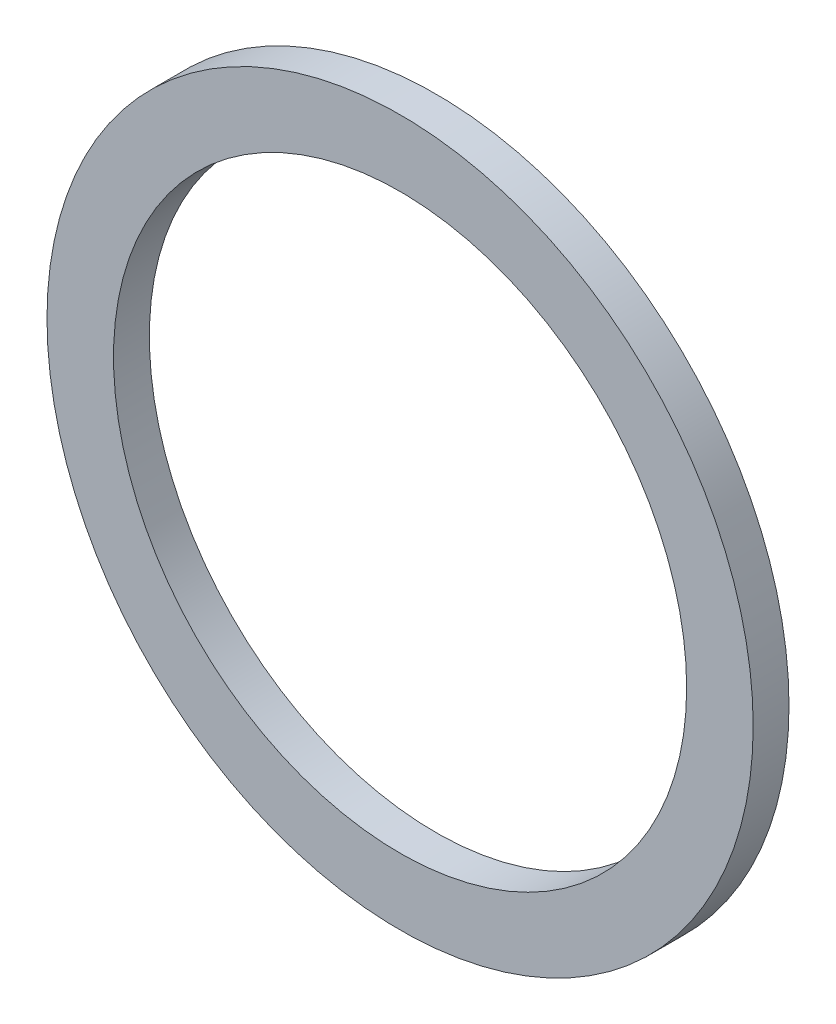
ISO-10303-21;
HEADER;
FILE_DESCRIPTION(('STEP AP214'),'2;1');
FILE_NAME('part.step','',(''),(''),'','','');
FILE_SCHEMA(('AUTOMOTIVE_DESIGN { 1 0 10303 214 1 1 1 1 }'));
ENDSEC;
DATA;
#1=APPLICATION_CONTEXT('core data for automotive mechanical design processes');
#2=APPLICATION_PROTOCOL_DEFINITION('international standard','automotive_design',2000,#1);
#3=PRODUCT_CONTEXT('',#1,'mechanical');
#4=PRODUCT('Part','Part','',(#3));
#5=PRODUCT_RELATED_PRODUCT_CATEGORY('part','',(#4));
#6=PRODUCT_DEFINITION_FORMATION('','',#4);
#7=PRODUCT_DEFINITION_CONTEXT('part definition',#1,'design');
#8=PRODUCT_DEFINITION('design','',#6,#7);
#9=PRODUCT_DEFINITION_SHAPE('','',#8);
#10=(LENGTH_UNIT() NAMED_UNIT(*) SI_UNIT(.MILLI.,.METRE.));
#11=(NAMED_UNIT(*) PLANE_ANGLE_UNIT() SI_UNIT($,.RADIAN.));
#12=(NAMED_UNIT(*) SI_UNIT($,.STERADIAN.) SOLID_ANGLE_UNIT());
#13=UNCERTAINTY_MEASURE_WITH_UNIT(LENGTH_MEASURE(1.E-05),#10,'distance_accuracy_value','');
#14=(GEOMETRIC_REPRESENTATION_CONTEXT(3) GLOBAL_UNCERTAINTY_ASSIGNED_CONTEXT((#13)) GLOBAL_UNIT_ASSIGNED_CONTEXT((#10,
#11,#12)) REPRESENTATION_CONTEXT('',''));
#15=CARTESIAN_POINT('',(0.,0.,0.));
#16=DIRECTION('',(0.,0.,1.));
#17=DIRECTION('',(1.,0.,0.));
#18=AXIS2_PLACEMENT_3D('',#15,#16,#17);
#19=CARTESIAN_POINT('',(0.,0.,1.75));
#20=DIRECTION('',(0.,0.,1.));
#21=DIRECTION('',(1.,0.,0.));
#22=AXIS2_PLACEMENT_3D('',#19,#20,#21);
#23=PLANE('',#22);
#24=CARTESIAN_POINT('',(0.,0.,1.75));
#25=DIRECTION('',(0.,0.,1.));
#26=DIRECTION('',(1.,0.,0.));
#27=AXIS2_PLACEMENT_3D('',#24,#25,#26);
#28=CIRCLE('',#27,17.25);
#29=CARTESIAN_POINT('',(17.25,0.,1.75));
#30=VERTEX_POINT('',#29);
#31=EDGE_CURVE('E10',#30,#30,#28,.T.);
#32=ORIENTED_EDGE('',*,*,#31,.T.);
#33=EDGE_LOOP('',(#32));
#34=FACE_BOUND('',#33,.T.);
#35=CARTESIAN_POINT('',(0.,0.,1.75));
#36=DIRECTION('',(0.,0.,1.));
#37=DIRECTION('',(1.,0.,0.));
#38=AXIS2_PLACEMENT_3D('',#35,#36,#37);
#39=CIRCLE('',#38,14.);
#40=CARTESIAN_POINT('',(14.,0.,1.75));
#41=VERTEX_POINT('',#40);
#42=EDGE_CURVE('E42',#41,#41,#39,.T.);
#43=ORIENTED_EDGE('',*,*,#42,.F.);
#44=EDGE_LOOP('',(#43));
#45=FACE_BOUND('',#44,.T.);
#46=ADVANCED_FACE('F31',(#34,#45),#23,.T.);
#47=CARTESIAN_POINT('',(0.,0.,0.));
#48=DIRECTION('',(0.,0.,1.));
#49=DIRECTION('',(1.,0.,0.));
#50=AXIS2_PLACEMENT_3D('',#47,#48,#49);
#51=PLANE('',#50);
#52=CARTESIAN_POINT('',(0.,0.,0.));
#53=DIRECTION('',(0.,0.,1.));
#54=DIRECTION('',(1.,0.,0.));
#55=AXIS2_PLACEMENT_3D('',#52,#53,#54);
#56=CIRCLE('',#55,17.25);
#57=CARTESIAN_POINT('',(17.25,0.,0.));
#58=VERTEX_POINT('',#57);
#59=EDGE_CURVE('E35',#58,#58,#56,.T.);
#60=ORIENTED_EDGE('',*,*,#59,.F.);
#61=EDGE_LOOP('',(#60));
#62=FACE_BOUND('',#61,.T.);
#63=CARTESIAN_POINT('',(0.,0.,0.));
#64=DIRECTION('',(0.,0.,1.));
#65=DIRECTION('',(1.,0.,0.));
#66=AXIS2_PLACEMENT_3D('',#63,#64,#65);
#67=CIRCLE('',#66,14.);
#68=CARTESIAN_POINT('',(14.,0.,0.));
#69=VERTEX_POINT('',#68);
#70=EDGE_CURVE('E44',#69,#69,#67,.T.);
#71=ORIENTED_EDGE('',*,*,#70,.T.);
#72=EDGE_LOOP('',(#71));
#73=FACE_BOUND('',#72,.T.);
#74=ADVANCED_FACE('F54',(#62,#73),#51,.F.);
#75=CARTESIAN_POINT('',(0.,0.,1.75));
#76=DIRECTION('',(0.,0.,-1.));
#77=DIRECTION('',(-1.,0.,0.));
#78=AXIS2_PLACEMENT_3D('',#75,#76,#77);
#79=CYLINDRICAL_SURFACE('',#78,17.25);
#80=ORIENTED_EDGE('',*,*,#31,.F.);
#81=EDGE_LOOP('',(#80));
#82=FACE_BOUND('',#81,.T.);
#83=ORIENTED_EDGE('',*,*,#59,.T.);
#84=EDGE_LOOP('',(#83));
#85=FACE_BOUND('',#84,.T.);
#86=ADVANCED_FACE('F33',(#82,#85),#79,.T.);
#87=CARTESIAN_POINT('',(0.,0.,1.75));
#88=DIRECTION('',(0.,0.,-1.));
#89=DIRECTION('',(-1.,0.,0.));
#90=AXIS2_PLACEMENT_3D('',#87,#88,#89);
#91=CYLINDRICAL_SURFACE('',#90,14.);
#92=ORIENTED_EDGE('',*,*,#42,.T.);
#93=EDGE_LOOP('',(#92));
#94=FACE_BOUND('',#93,.T.);
#95=ORIENTED_EDGE('',*,*,#70,.F.);
#96=EDGE_LOOP('',(#95));
#97=FACE_BOUND('',#96,.T.);
#98=ADVANCED_FACE('F50',(#94,#97),#91,.F.);
#99=CLOSED_SHELL('',(#46,#74,#86,#98));
#100=MANIFOLD_SOLID_BREP('B2',#99);
#101=ADVANCED_BREP_SHAPE_REPRESENTATION('',(#18,#100),#14);
#102=SHAPE_DEFINITION_REPRESENTATION(#9,#101);
ENDSEC;
END-ISO-10303-21;
